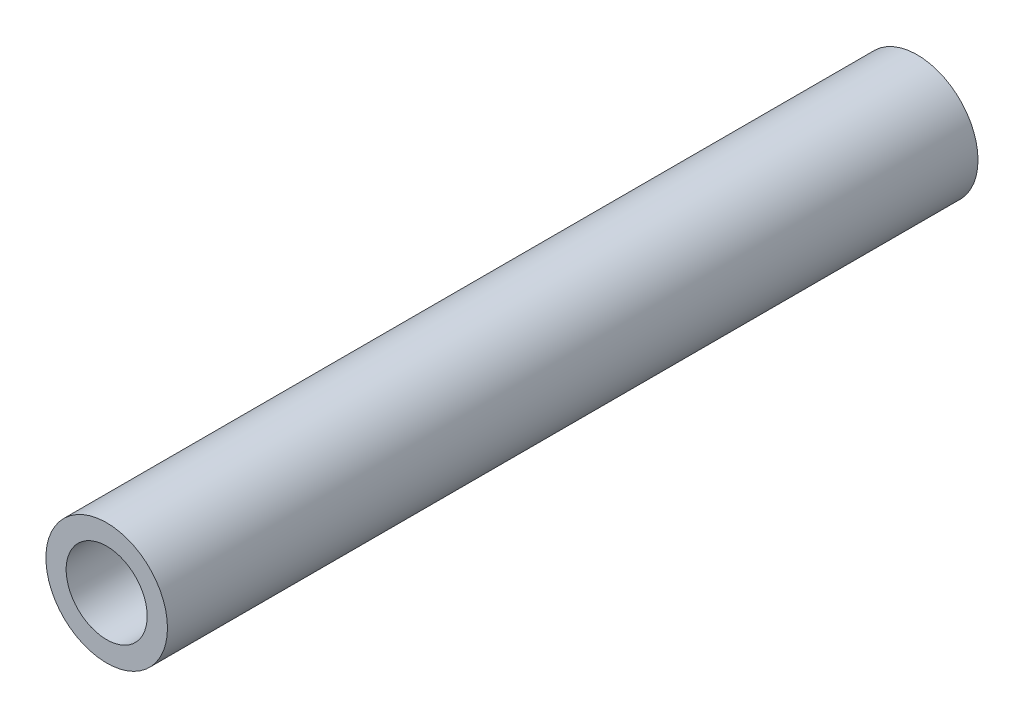
ISO-10303-21;
HEADER;
FILE_DESCRIPTION(('STEP AP214'),'2;1');
FILE_NAME('part.step','',(''),(''),'','','');
FILE_SCHEMA(('AUTOMOTIVE_DESIGN { 1 0 10303 214 1 1 1 1 }'));
ENDSEC;
DATA;
#1=APPLICATION_CONTEXT('core data for automotive mechanical design processes');
#2=APPLICATION_PROTOCOL_DEFINITION('international standard','automotive_design',2000,#1);
#3=PRODUCT_CONTEXT('',#1,'mechanical');
#4=PRODUCT('Part','Part','',(#3));
#5=PRODUCT_RELATED_PRODUCT_CATEGORY('part','',(#4));
#6=PRODUCT_DEFINITION_FORMATION('','',#4);
#7=PRODUCT_DEFINITION_CONTEXT('part definition',#1,'design');
#8=PRODUCT_DEFINITION('design','',#6,#7);
#9=PRODUCT_DEFINITION_SHAPE('','',#8);
#10=(LENGTH_UNIT() NAMED_UNIT(*) SI_UNIT(.MILLI.,.METRE.));
#11=(NAMED_UNIT(*) PLANE_ANGLE_UNIT() SI_UNIT($,.RADIAN.));
#12=(NAMED_UNIT(*) SI_UNIT($,.STERADIAN.) SOLID_ANGLE_UNIT());
#13=UNCERTAINTY_MEASURE_WITH_UNIT(LENGTH_MEASURE(1.E-05),#10,'distance_accuracy_value','');
#14=(GEOMETRIC_REPRESENTATION_CONTEXT(3) GLOBAL_UNCERTAINTY_ASSIGNED_CONTEXT((#13)) GLOBAL_UNIT_ASSIGNED_CONTEXT((#10,
#11,#12)) REPRESENTATION_CONTEXT('',''));
#15=CARTESIAN_POINT('',(0.,0.,0.));
#16=DIRECTION('',(0.,0.,1.));
#17=DIRECTION('',(1.,0.,0.));
#18=AXIS2_PLACEMENT_3D('',#15,#16,#17);
#19=CARTESIAN_POINT('',(0.,0.,20.));
#20=DIRECTION('',(0.,0.,1.));
#21=DIRECTION('',(1.,0.,0.));
#22=AXIS2_PLACEMENT_3D('',#19,#20,#21);
#23=PLANE('',#22);
#24=CARTESIAN_POINT('',(0.,0.,20.));
#25=DIRECTION('',(0.,0.,1.));
#26=DIRECTION('',(1.,0.,0.));
#27=AXIS2_PLACEMENT_3D('',#24,#25,#26);
#28=CIRCLE('',#27,3.);
#29=CARTESIAN_POINT('',(3.,0.,20.));
#30=VERTEX_POINT('',#29);
#31=EDGE_CURVE('E10',#30,#30,#28,.T.);
#32=ORIENTED_EDGE('',*,*,#31,.T.);
#33=EDGE_LOOP('',(#32));
#34=FACE_BOUND('',#33,.T.);
#35=CARTESIAN_POINT('',(0.,0.,20.));
#36=DIRECTION('',(0.,0.,1.));
#37=DIRECTION('',(1.,0.,0.));
#38=AXIS2_PLACEMENT_3D('',#35,#36,#37);
#39=CIRCLE('',#38,2.);
#40=CARTESIAN_POINT('',(2.,0.,20.));
#41=VERTEX_POINT('',#40);
#42=EDGE_CURVE('E44',#41,#41,#39,.T.);
#43=ORIENTED_EDGE('',*,*,#42,.F.);
#44=EDGE_LOOP('',(#43));
#45=FACE_BOUND('',#44,.T.);
#46=ADVANCED_FACE('F33',(#34,#45),#23,.T.);
#47=CARTESIAN_POINT('',(0.,0.,-20.));
#48=DIRECTION('',(0.,0.,1.));
#49=DIRECTION('',(1.,0.,0.));
#50=AXIS2_PLACEMENT_3D('',#47,#48,#49);
#51=PLANE('',#50);
#52=CARTESIAN_POINT('',(0.,0.,-20.));
#53=DIRECTION('',(0.,0.,1.));
#54=DIRECTION('',(1.,0.,0.));
#55=AXIS2_PLACEMENT_3D('',#52,#53,#54);
#56=CIRCLE('',#55,3.);
#57=CARTESIAN_POINT('',(3.,0.,-20.));
#58=VERTEX_POINT('',#57);
#59=EDGE_CURVE('E37',#58,#58,#56,.T.);
#60=ORIENTED_EDGE('',*,*,#59,.F.);
#61=EDGE_LOOP('',(#60));
#62=FACE_BOUND('',#61,.T.);
#63=CARTESIAN_POINT('',(0.,0.,-20.));
#64=DIRECTION('',(0.,0.,1.));
#65=DIRECTION('',(1.,0.,0.));
#66=AXIS2_PLACEMENT_3D('',#63,#64,#65);
#67=CIRCLE('',#66,2.);
#68=CARTESIAN_POINT('',(2.,0.,-20.));
#69=VERTEX_POINT('',#68);
#70=EDGE_CURVE('E46',#69,#69,#67,.T.);
#71=ORIENTED_EDGE('',*,*,#70,.T.);
#72=EDGE_LOOP('',(#71));
#73=FACE_BOUND('',#72,.T.);
#74=ADVANCED_FACE('F56',(#62,#73),#51,.F.);
#75=CARTESIAN_POINT('',(0.,0.,20.));
#76=DIRECTION('',(0.,0.,-1.));
#77=DIRECTION('',(-1.,0.,0.));
#78=AXIS2_PLACEMENT_3D('',#75,#76,#77);
#79=CYLINDRICAL_SURFACE('',#78,3.);
#80=ORIENTED_EDGE('',*,*,#31,.F.);
#81=EDGE_LOOP('',(#80));
#82=FACE_BOUND('',#81,.T.);
#83=ORIENTED_EDGE('',*,*,#59,.T.);
#84=EDGE_LOOP('',(#83));
#85=FACE_BOUND('',#84,.T.);
#86=ADVANCED_FACE('F35',(#82,#85),#79,.T.);
#87=CARTESIAN_POINT('',(0.,0.,20.));
#88=DIRECTION('',(0.,0.,-1.));
#89=DIRECTION('',(-1.,0.,0.));
#90=AXIS2_PLACEMENT_3D('',#87,#88,#89);
#91=CYLINDRICAL_SURFACE('',#90,2.);
#92=ORIENTED_EDGE('',*,*,#42,.T.);
#93=EDGE_LOOP('',(#92));
#94=FACE_BOUND('',#93,.T.);
#95=ORIENTED_EDGE('',*,*,#70,.F.);
#96=EDGE_LOOP('',(#95));
#97=FACE_BOUND('',#96,.T.);
#98=ADVANCED_FACE('F52',(#94,#97),#91,.F.);
#99=CLOSED_SHELL('',(#46,#74,#86,#98));
#100=MANIFOLD_SOLID_BREP('B2',#99);
#101=ADVANCED_BREP_SHAPE_REPRESENTATION('',(#18,#100),#14);
#102=SHAPE_DEFINITION_REPRESENTATION(#9,#101);
ENDSEC;
END-ISO-10303-21;
